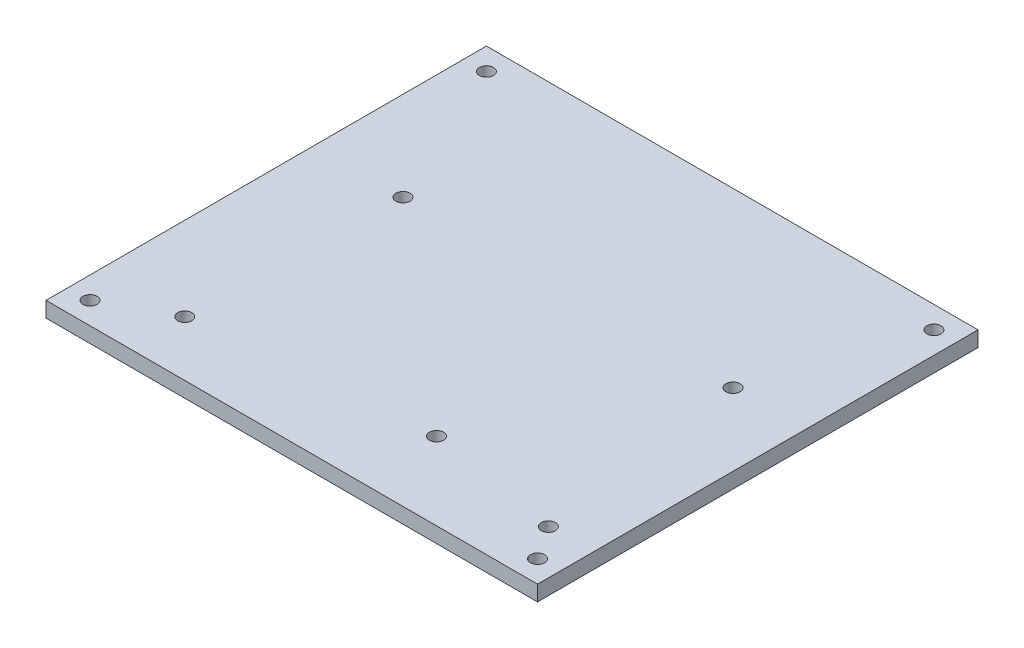
ISO-10303-21;
HEADER;
FILE_DESCRIPTION(('STEP AP214'),'2;1');
FILE_NAME('part.step','',(''),(''),'','','');
FILE_SCHEMA(('AUTOMOTIVE_DESIGN { 1 0 10303 214 1 1 1 1 }'));
ENDSEC;
DATA;
#1=APPLICATION_CONTEXT('core data for automotive mechanical design processes');
#2=APPLICATION_PROTOCOL_DEFINITION('international standard','automotive_design',2000,#1);
#3=PRODUCT_CONTEXT('',#1,'mechanical');
#4=PRODUCT('Part','Part','',(#3));
#5=PRODUCT_RELATED_PRODUCT_CATEGORY('part','',(#4));
#6=PRODUCT_DEFINITION_FORMATION('','',#4);
#7=PRODUCT_DEFINITION_CONTEXT('part definition',#1,'design');
#8=PRODUCT_DEFINITION('design','',#6,#7);
#9=PRODUCT_DEFINITION_SHAPE('','',#8);
#10=(LENGTH_UNIT() NAMED_UNIT(*) SI_UNIT(.MILLI.,.METRE.));
#11=(NAMED_UNIT(*) PLANE_ANGLE_UNIT() SI_UNIT($,.RADIAN.));
#12=(NAMED_UNIT(*) SI_UNIT($,.STERADIAN.) SOLID_ANGLE_UNIT());
#13=UNCERTAINTY_MEASURE_WITH_UNIT(LENGTH_MEASURE(1.E-05),#10,'distance_accuracy_value','');
#14=(GEOMETRIC_REPRESENTATION_CONTEXT(3) GLOBAL_UNCERTAINTY_ASSIGNED_CONTEXT((#13)) GLOBAL_UNIT_ASSIGNED_CONTEXT((#10,
#11,#12)) REPRESENTATION_CONTEXT('',''));
#15=CARTESIAN_POINT('',(0.,0.,0.));
#16=DIRECTION('',(0.,0.,1.));
#17=DIRECTION('',(1.,0.,0.));
#18=AXIS2_PLACEMENT_3D('',#15,#16,#17);
#19=CARTESIAN_POINT('',(0.,3.5,0.));
#20=DIRECTION('',(0.,-1.,0.));
#21=DIRECTION('',(0.,0.,-1.));
#22=AXIS2_PLACEMENT_3D('',#19,#20,#21);
#23=PLANE('',#22);
#24=DIRECTION('',(0.,0.,1.));
#25=VECTOR('',#24,1.);
#26=CARTESIAN_POINT('',(0.,3.5,0.));
#27=LINE('',#26,#25);
#28=CARTESIAN_POINT('',(0.,3.5,-100.));
#29=VERTEX_POINT('',#28);
#30=CARTESIAN_POINT('',(0.,3.5,0.));
#31=VERTEX_POINT('',#30);
#32=EDGE_CURVE('E92',#29,#31,#27,.T.);
#33=ORIENTED_EDGE('',*,*,#32,.T.);
#34=DIRECTION('',(1.,0.,0.));
#35=VECTOR('',#34,1.);
#36=CARTESIAN_POINT('',(0.,3.5,0.));
#37=LINE('',#36,#35);
#38=CARTESIAN_POINT('',(111.6,3.5,0.));
#39=VERTEX_POINT('',#38);
#40=EDGE_CURVE('E87',#31,#39,#37,.T.);
#41=ORIENTED_EDGE('',*,*,#40,.T.);
#42=DIRECTION('',(0.,0.,-1.));
#43=VECTOR('',#42,1.);
#44=CARTESIAN_POINT('',(111.6,3.5,0.));
#45=LINE('',#44,#43);
#46=CARTESIAN_POINT('',(111.6,3.5,-100.));
#47=VERTEX_POINT('',#46);
#48=EDGE_CURVE('E90',#39,#47,#45,.T.);
#49=ORIENTED_EDGE('',*,*,#48,.T.);
#50=DIRECTION('',(-1.,0.,0.));
#51=VECTOR('',#50,1.);
#52=CARTESIAN_POINT('',(0.,3.5,-100.));
#53=LINE('',#52,#51);
#54=EDGE_CURVE('E57',#47,#29,#53,.T.);
#55=ORIENTED_EDGE('',*,*,#54,.T.);
#56=EDGE_LOOP('',(#33,#41,#49,#55));
#57=FACE_BOUND('',#56,.T.);
#58=CARTESIAN_POINT('',(20.24,3.5,-60.8));
#59=DIRECTION('',(0.,1.,0.));
#60=DIRECTION('',(0.,0.,1.));
#61=AXIS2_PLACEMENT_3D('',#58,#59,#60);
#62=CIRCLE('',#61,1.60000000000001);
#63=CARTESIAN_POINT('',(20.24,3.5,-59.2));
#64=VERTEX_POINT('',#63);
#65=EDGE_CURVE('E112',#64,#64,#62,.T.);
#66=ORIENTED_EDGE('',*,*,#65,.F.);
#67=EDGE_LOOP('',(#66));
#68=FACE_BOUND('',#67,.T.);
#69=CARTESIAN_POINT('',(18.97,3.5,-12.54));
#70=DIRECTION('',(0.,1.,0.));
#71=DIRECTION('',(0.,0.,1.));
#72=AXIS2_PLACEMENT_3D('',#69,#70,#71);
#73=CIRCLE('',#72,1.6);
#74=CARTESIAN_POINT('',(18.97,3.5,-10.94));
#75=VERTEX_POINT('',#74);
#76=EDGE_CURVE('E134',#75,#75,#73,.T.);
#77=ORIENTED_EDGE('',*,*,#76,.F.);
#78=EDGE_LOOP('',(#77));
#79=FACE_BOUND('',#78,.T.);
#80=CARTESIAN_POINT('',(71.04,3.5,-17.62));
#81=DIRECTION('',(0.,1.,0.));
#82=DIRECTION('',(0.,0.,1.));
#83=AXIS2_PLACEMENT_3D('',#80,#81,#82);
#84=CIRCLE('',#83,1.6);
#85=CARTESIAN_POINT('',(71.04,3.5,-16.02));
#86=VERTEX_POINT('',#85);
#87=EDGE_CURVE('E142',#86,#86,#84,.T.);
#88=ORIENTED_EDGE('',*,*,#87,.F.);
#89=EDGE_LOOP('',(#88));
#90=FACE_BOUND('',#89,.T.);
#91=CARTESIAN_POINT('',(101.52,3.5,-12.54));
#92=DIRECTION('',(0.,1.,0.));
#93=DIRECTION('',(0.,0.,1.));
#94=AXIS2_PLACEMENT_3D('',#91,#92,#93);
#95=CIRCLE('',#94,1.6);
#96=CARTESIAN_POINT('',(101.52,3.5,-10.94));
#97=VERTEX_POINT('',#96);
#98=EDGE_CURVE('E150',#97,#97,#95,.T.);
#99=ORIENTED_EDGE('',*,*,#98,.F.);
#100=EDGE_LOOP('',(#99));
#101=FACE_BOUND('',#100,.T.);
#102=CARTESIAN_POINT('',(95.17,3.5,-60.8));
#103=DIRECTION('',(0.,1.,0.));
#104=DIRECTION('',(0.,0.,1.));
#105=AXIS2_PLACEMENT_3D('',#102,#103,#104);
#106=CIRCLE('',#105,1.60000000000001);
#107=CARTESIAN_POINT('',(95.17,3.5,-59.2));
#108=VERTEX_POINT('',#107);
#109=EDGE_CURVE('E158',#108,#108,#106,.T.);
#110=ORIENTED_EDGE('',*,*,#109,.F.);
#111=EDGE_LOOP('',(#110));
#112=FACE_BOUND('',#111,.T.);
#113=CARTESIAN_POINT('',(106.6,3.5,-4.99999999999999));
#114=DIRECTION('',(0.,1.,0.));
#115=DIRECTION('',(0.,0.,1.));
#116=AXIS2_PLACEMENT_3D('',#113,#114,#115);
#117=CIRCLE('',#116,1.59999999999999);
#118=CARTESIAN_POINT('',(106.6,3.5,-3.4));
#119=VERTEX_POINT('',#118);
#120=EDGE_CURVE('E166',#119,#119,#117,.T.);
#121=ORIENTED_EDGE('',*,*,#120,.F.);
#122=EDGE_LOOP('',(#121));
#123=FACE_BOUND('',#122,.T.);
#124=CARTESIAN_POINT('',(5.,3.5,-4.99999999999999));
#125=DIRECTION('',(0.,1.,0.));
#126=DIRECTION('',(0.,0.,-1.));
#127=AXIS2_PLACEMENT_3D('',#124,#125,#126);
#128=CIRCLE('',#127,1.59999999999999);
#129=CARTESIAN_POINT('',(5.,3.5,-6.59999999999998));
#130=VERTEX_POINT('',#129);
#131=EDGE_CURVE('E174',#130,#130,#128,.T.);
#132=ORIENTED_EDGE('',*,*,#131,.F.);
#133=EDGE_LOOP('',(#132));
#134=FACE_BOUND('',#133,.T.);
#135=CARTESIAN_POINT('',(106.6,3.5,-95.));
#136=DIRECTION('',(0.,1.,0.));
#137=DIRECTION('',(0.,0.,1.));
#138=AXIS2_PLACEMENT_3D('',#135,#136,#137);
#139=CIRCLE('',#138,1.60000000000001);
#140=CARTESIAN_POINT('',(106.6,3.5,-93.4));
#141=VERTEX_POINT('',#140);
#142=EDGE_CURVE('E182',#141,#141,#139,.T.);
#143=ORIENTED_EDGE('',*,*,#142,.F.);
#144=EDGE_LOOP('',(#143));
#145=FACE_BOUND('',#144,.T.);
#146=CARTESIAN_POINT('',(5.,3.5,-95.));
#147=DIRECTION('',(0.,1.,0.));
#148=DIRECTION('',(0.,0.,-1.));
#149=AXIS2_PLACEMENT_3D('',#146,#147,#148);
#150=CIRCLE('',#149,1.60000000000001);
#151=CARTESIAN_POINT('',(5.,3.5,-96.6));
#152=VERTEX_POINT('',#151);
#153=EDGE_CURVE('E190',#152,#152,#150,.T.);
#154=ORIENTED_EDGE('',*,*,#153,.F.);
#155=EDGE_LOOP('',(#154));
#156=FACE_BOUND('',#155,.T.);
#157=ADVANCED_FACE('F39',(#57,#68,#79,#90,#101,#112,#123,#134,#145,#156),#23,.F.);
#158=CARTESIAN_POINT('',(0.,0.,0.));
#159=DIRECTION('',(0.,-1.,0.));
#160=DIRECTION('',(0.,0.,-1.));
#161=AXIS2_PLACEMENT_3D('',#158,#159,#160);
#162=PLANE('',#161);
#163=CARTESIAN_POINT('',(106.6,0.,-95.));
#164=DIRECTION('',(0.,1.,0.));
#165=DIRECTION('',(0.,0.,1.));
#166=AXIS2_PLACEMENT_3D('',#163,#164,#165);
#167=CIRCLE('',#166,1.60000000000001);
#168=CARTESIAN_POINT('',(106.6,0.,-93.4));
#169=VERTEX_POINT('',#168);
#170=EDGE_CURVE('E186',#169,#169,#167,.T.);
#171=ORIENTED_EDGE('',*,*,#170,.T.);
#172=EDGE_LOOP('',(#171));
#173=FACE_BOUND('',#172,.T.);
#174=CARTESIAN_POINT('',(106.6,0.,-4.99999999999999));
#175=DIRECTION('',(0.,1.,0.));
#176=DIRECTION('',(0.,0.,1.));
#177=AXIS2_PLACEMENT_3D('',#174,#175,#176);
#178=CIRCLE('',#177,1.59999999999999);
#179=CARTESIAN_POINT('',(106.6,0.,-3.4));
#180=VERTEX_POINT('',#179);
#181=EDGE_CURVE('E170',#180,#180,#178,.T.);
#182=ORIENTED_EDGE('',*,*,#181,.T.);
#183=EDGE_LOOP('',(#182));
#184=FACE_BOUND('',#183,.T.);
#185=CARTESIAN_POINT('',(101.52,0.,-12.54));
#186=DIRECTION('',(0.,1.,0.));
#187=DIRECTION('',(0.,0.,1.));
#188=AXIS2_PLACEMENT_3D('',#185,#186,#187);
#189=CIRCLE('',#188,1.6);
#190=CARTESIAN_POINT('',(101.52,0.,-10.94));
#191=VERTEX_POINT('',#190);
#192=EDGE_CURVE('E154',#191,#191,#189,.T.);
#193=ORIENTED_EDGE('',*,*,#192,.T.);
#194=EDGE_LOOP('',(#193));
#195=FACE_BOUND('',#194,.T.);
#196=CARTESIAN_POINT('',(18.97,0.,-12.54));
#197=DIRECTION('',(0.,1.,0.));
#198=DIRECTION('',(0.,0.,1.));
#199=AXIS2_PLACEMENT_3D('',#196,#197,#198);
#200=CIRCLE('',#199,1.6);
#201=CARTESIAN_POINT('',(18.97,0.,-10.94));
#202=VERTEX_POINT('',#201);
#203=EDGE_CURVE('E138',#202,#202,#200,.T.);
#204=ORIENTED_EDGE('',*,*,#203,.T.);
#205=EDGE_LOOP('',(#204));
#206=FACE_BOUND('',#205,.T.);
#207=DIRECTION('',(0.,0.,1.));
#208=VECTOR('',#207,1.);
#209=CARTESIAN_POINT('',(0.,0.,0.));
#210=LINE('',#209,#208);
#211=CARTESIAN_POINT('',(0.,0.,-100.));
#212=VERTEX_POINT('',#211);
#213=CARTESIAN_POINT('',(0.,0.,0.));
#214=VERTEX_POINT('',#213);
#215=EDGE_CURVE('E108',#212,#214,#210,.T.);
#216=ORIENTED_EDGE('',*,*,#215,.F.);
#217=DIRECTION('',(-1.,0.,0.));
#218=VECTOR('',#217,1.);
#219=CARTESIAN_POINT('',(0.,0.,-100.));
#220=LINE('',#219,#218);
#221=CARTESIAN_POINT('',(111.6,0.,-100.));
#222=VERTEX_POINT('',#221);
#223=EDGE_CURVE('E80',#222,#212,#220,.T.);
#224=ORIENTED_EDGE('',*,*,#223,.F.);
#225=DIRECTION('',(0.,0.,-1.));
#226=VECTOR('',#225,1.);
#227=CARTESIAN_POINT('',(111.6,0.,0.));
#228=LINE('',#227,#226);
#229=CARTESIAN_POINT('',(111.6,0.,0.));
#230=VERTEX_POINT('',#229);
#231=EDGE_CURVE('E74',#230,#222,#228,.T.);
#232=ORIENTED_EDGE('',*,*,#231,.F.);
#233=DIRECTION('',(1.,0.,0.));
#234=VECTOR('',#233,1.);
#235=CARTESIAN_POINT('',(0.,0.,0.));
#236=LINE('',#235,#234);
#237=EDGE_CURVE('E97',#214,#230,#236,.T.);
#238=ORIENTED_EDGE('',*,*,#237,.F.);
#239=EDGE_LOOP('',(#216,#224,#232,#238));
#240=FACE_BOUND('',#239,.T.);
#241=CARTESIAN_POINT('',(20.24,0.,-60.8));
#242=DIRECTION('',(0.,1.,0.));
#243=DIRECTION('',(0.,0.,1.));
#244=AXIS2_PLACEMENT_3D('',#241,#242,#243);
#245=CIRCLE('',#244,1.60000000000001);
#246=CARTESIAN_POINT('',(20.24,0.,-59.2));
#247=VERTEX_POINT('',#246);
#248=EDGE_CURVE('E130',#247,#247,#245,.T.);
#249=ORIENTED_EDGE('',*,*,#248,.T.);
#250=EDGE_LOOP('',(#249));
#251=FACE_BOUND('',#250,.T.);
#252=CARTESIAN_POINT('',(71.04,0.,-17.62));
#253=DIRECTION('',(0.,1.,0.));
#254=DIRECTION('',(0.,0.,1.));
#255=AXIS2_PLACEMENT_3D('',#252,#253,#254);
#256=CIRCLE('',#255,1.6);
#257=CARTESIAN_POINT('',(71.04,0.,-16.02));
#258=VERTEX_POINT('',#257);
#259=EDGE_CURVE('E146',#258,#258,#256,.T.);
#260=ORIENTED_EDGE('',*,*,#259,.T.);
#261=EDGE_LOOP('',(#260));
#262=FACE_BOUND('',#261,.T.);
#263=CARTESIAN_POINT('',(95.17,0.,-60.8));
#264=DIRECTION('',(0.,1.,0.));
#265=DIRECTION('',(0.,0.,1.));
#266=AXIS2_PLACEMENT_3D('',#263,#264,#265);
#267=CIRCLE('',#266,1.60000000000001);
#268=CARTESIAN_POINT('',(95.17,0.,-59.2));
#269=VERTEX_POINT('',#268);
#270=EDGE_CURVE('E162',#269,#269,#267,.T.);
#271=ORIENTED_EDGE('',*,*,#270,.T.);
#272=EDGE_LOOP('',(#271));
#273=FACE_BOUND('',#272,.T.);
#274=CARTESIAN_POINT('',(5.,0.,-4.99999999999999));
#275=DIRECTION('',(0.,1.,0.));
#276=DIRECTION('',(0.,0.,-1.));
#277=AXIS2_PLACEMENT_3D('',#274,#275,#276);
#278=CIRCLE('',#277,1.59999999999999);
#279=CARTESIAN_POINT('',(5.,0.,-6.59999999999998));
#280=VERTEX_POINT('',#279);
#281=EDGE_CURVE('E178',#280,#280,#278,.T.);
#282=ORIENTED_EDGE('',*,*,#281,.T.);
#283=EDGE_LOOP('',(#282));
#284=FACE_BOUND('',#283,.T.);
#285=CARTESIAN_POINT('',(5.,0.,-95.));
#286=DIRECTION('',(0.,1.,0.));
#287=DIRECTION('',(0.,0.,-1.));
#288=AXIS2_PLACEMENT_3D('',#285,#286,#287);
#289=CIRCLE('',#288,1.60000000000001);
#290=CARTESIAN_POINT('',(5.,0.,-96.6));
#291=VERTEX_POINT('',#290);
#292=EDGE_CURVE('E194',#291,#291,#289,.T.);
#293=ORIENTED_EDGE('',*,*,#292,.T.);
#294=EDGE_LOOP('',(#293));
#295=FACE_BOUND('',#294,.T.);
#296=ADVANCED_FACE('F125',(#173,#184,#195,#206,#240,#251,#262,#273,#284,#295),#162,.T.);
#297=CARTESIAN_POINT('',(0.,3.5,0.));
#298=DIRECTION('',(1.,0.,0.));
#299=DIRECTION('',(0.,0.,-1.));
#300=AXIS2_PLACEMENT_3D('',#297,#298,#299);
#301=PLANE('',#300);
#302=ORIENTED_EDGE('',*,*,#215,.T.);
#303=DIRECTION('',(0.,-1.,0.));
#304=VECTOR('',#303,1.);
#305=CARTESIAN_POINT('',(0.,3.5,0.));
#306=LINE('',#305,#304);
#307=EDGE_CURVE('E11',#31,#214,#306,.T.);
#308=ORIENTED_EDGE('',*,*,#307,.F.);
#309=ORIENTED_EDGE('',*,*,#32,.F.);
#310=DIRECTION('',(0.,-1.,0.));
#311=VECTOR('',#310,1.);
#312=CARTESIAN_POINT('',(0.,3.5,-100.));
#313=LINE('',#312,#311);
#314=EDGE_CURVE('E104',#29,#212,#313,.T.);
#315=ORIENTED_EDGE('',*,*,#314,.T.);
#316=EDGE_LOOP('',(#302,#308,#309,#315));
#317=FACE_BOUND('',#316,.T.);
#318=ADVANCED_FACE('F41',(#317),#301,.F.);
#319=CARTESIAN_POINT('',(0.,3.5,0.));
#320=DIRECTION('',(0.,0.,-1.));
#321=DIRECTION('',(-1.,0.,0.));
#322=AXIS2_PLACEMENT_3D('',#319,#320,#321);
#323=PLANE('',#322);
#324=ORIENTED_EDGE('',*,*,#237,.T.);
#325=DIRECTION('',(0.,-1.,0.));
#326=VECTOR('',#325,1.);
#327=CARTESIAN_POINT('',(111.6,3.5,0.));
#328=LINE('',#327,#326);
#329=EDGE_CURVE('E49',#39,#230,#328,.T.);
#330=ORIENTED_EDGE('',*,*,#329,.F.);
#331=ORIENTED_EDGE('',*,*,#40,.F.);
#332=ORIENTED_EDGE('',*,*,#307,.T.);
#333=EDGE_LOOP('',(#324,#330,#331,#332));
#334=FACE_BOUND('',#333,.T.);
#335=ADVANCED_FACE('F96',(#334),#323,.F.);
#336=CARTESIAN_POINT('',(111.6,3.5,0.));
#337=DIRECTION('',(-1.,0.,0.));
#338=DIRECTION('',(0.,0.,1.));
#339=AXIS2_PLACEMENT_3D('',#336,#337,#338);
#340=PLANE('',#339);
#341=ORIENTED_EDGE('',*,*,#231,.T.);
#342=DIRECTION('',(0.,-1.,0.));
#343=VECTOR('',#342,1.);
#344=CARTESIAN_POINT('',(111.6,3.5,-100.));
#345=LINE('',#344,#343);
#346=EDGE_CURVE('E99',#47,#222,#345,.T.);
#347=ORIENTED_EDGE('',*,*,#346,.F.);
#348=ORIENTED_EDGE('',*,*,#48,.F.);
#349=ORIENTED_EDGE('',*,*,#329,.T.);
#350=EDGE_LOOP('',(#341,#347,#348,#349));
#351=FACE_BOUND('',#350,.T.);
#352=ADVANCED_FACE('F100',(#351),#340,.F.);
#353=CARTESIAN_POINT('',(0.,3.5,-100.));
#354=DIRECTION('',(0.,0.,1.));
#355=DIRECTION('',(1.,0.,0.));
#356=AXIS2_PLACEMENT_3D('',#353,#354,#355);
#357=PLANE('',#356);
#358=ORIENTED_EDGE('',*,*,#223,.T.);
#359=ORIENTED_EDGE('',*,*,#314,.F.);
#360=ORIENTED_EDGE('',*,*,#54,.F.);
#361=ORIENTED_EDGE('',*,*,#346,.T.);
#362=EDGE_LOOP('',(#358,#359,#360,#361));
#363=FACE_BOUND('',#362,.T.);
#364=ADVANCED_FACE('F122',(#363),#357,.F.);
#365=CARTESIAN_POINT('',(20.24,3.5,-60.8));
#366=DIRECTION('',(0.,-1.,0.));
#367=DIRECTION('',(0.,0.,-1.));
#368=AXIS2_PLACEMENT_3D('',#365,#366,#367);
#369=CYLINDRICAL_SURFACE('',#368,1.60000000000001);
#370=ORIENTED_EDGE('',*,*,#65,.T.);
#371=EDGE_LOOP('',(#370));
#372=FACE_BOUND('',#371,.T.);
#373=ORIENTED_EDGE('',*,*,#248,.F.);
#374=EDGE_LOOP('',(#373));
#375=FACE_BOUND('',#374,.T.);
#376=ADVANCED_FACE('F213',(#372,#375),#369,.F.);
#377=CARTESIAN_POINT('',(18.97,3.5,-12.54));
#378=DIRECTION('',(0.,-1.,0.));
#379=DIRECTION('',(0.,0.,-1.));
#380=AXIS2_PLACEMENT_3D('',#377,#378,#379);
#381=CYLINDRICAL_SURFACE('',#380,1.6);
#382=ORIENTED_EDGE('',*,*,#76,.T.);
#383=EDGE_LOOP('',(#382));
#384=FACE_BOUND('',#383,.T.);
#385=ORIENTED_EDGE('',*,*,#203,.F.);
#386=EDGE_LOOP('',(#385));
#387=FACE_BOUND('',#386,.T.);
#388=ADVANCED_FACE('F259',(#384,#387),#381,.F.);
#389=CARTESIAN_POINT('',(71.04,3.5,-17.62));
#390=DIRECTION('',(0.,-1.,0.));
#391=DIRECTION('',(0.,0.,-1.));
#392=AXIS2_PLACEMENT_3D('',#389,#390,#391);
#393=CYLINDRICAL_SURFACE('',#392,1.6);
#394=ORIENTED_EDGE('',*,*,#87,.T.);
#395=EDGE_LOOP('',(#394));
#396=FACE_BOUND('',#395,.T.);
#397=ORIENTED_EDGE('',*,*,#259,.F.);
#398=EDGE_LOOP('',(#397));
#399=FACE_BOUND('',#398,.T.);
#400=ADVANCED_FACE('F267',(#396,#399),#393,.F.);
#401=CARTESIAN_POINT('',(101.52,3.5,-12.54));
#402=DIRECTION('',(0.,-1.,0.));
#403=DIRECTION('',(0.,0.,-1.));
#404=AXIS2_PLACEMENT_3D('',#401,#402,#403);
#405=CYLINDRICAL_SURFACE('',#404,1.6);
#406=ORIENTED_EDGE('',*,*,#98,.T.);
#407=EDGE_LOOP('',(#406));
#408=FACE_BOUND('',#407,.T.);
#409=ORIENTED_EDGE('',*,*,#192,.F.);
#410=EDGE_LOOP('',(#409));
#411=FACE_BOUND('',#410,.T.);
#412=ADVANCED_FACE('F275',(#408,#411),#405,.F.);
#413=CARTESIAN_POINT('',(95.17,3.5,-60.8));
#414=DIRECTION('',(0.,-1.,0.));
#415=DIRECTION('',(0.,0.,-1.));
#416=AXIS2_PLACEMENT_3D('',#413,#414,#415);
#417=CYLINDRICAL_SURFACE('',#416,1.60000000000001);
#418=ORIENTED_EDGE('',*,*,#109,.T.);
#419=EDGE_LOOP('',(#418));
#420=FACE_BOUND('',#419,.T.);
#421=ORIENTED_EDGE('',*,*,#270,.F.);
#422=EDGE_LOOP('',(#421));
#423=FACE_BOUND('',#422,.T.);
#424=ADVANCED_FACE('F284',(#420,#423),#417,.F.);
#425=CARTESIAN_POINT('',(106.6,3.5,-4.99999999999999));
#426=DIRECTION('',(0.,-1.,0.));
#427=DIRECTION('',(0.,0.,-1.));
#428=AXIS2_PLACEMENT_3D('',#425,#426,#427);
#429=CYLINDRICAL_SURFACE('',#428,1.59999999999999);
#430=ORIENTED_EDGE('',*,*,#120,.T.);
#431=EDGE_LOOP('',(#430));
#432=FACE_BOUND('',#431,.T.);
#433=ORIENTED_EDGE('',*,*,#181,.F.);
#434=EDGE_LOOP('',(#433));
#435=FACE_BOUND('',#434,.T.);
#436=ADVANCED_FACE('F293',(#432,#435),#429,.F.);
#437=CARTESIAN_POINT('',(5.,3.5,-4.99999999999999));
#438=DIRECTION('',(0.,-1.,0.));
#439=DIRECTION('',(0.,0.,-1.));
#440=AXIS2_PLACEMENT_3D('',#437,#438,#439);
#441=CYLINDRICAL_SURFACE('',#440,1.59999999999999);
#442=ORIENTED_EDGE('',*,*,#131,.T.);
#443=EDGE_LOOP('',(#442));
#444=FACE_BOUND('',#443,.T.);
#445=ORIENTED_EDGE('',*,*,#281,.F.);
#446=EDGE_LOOP('',(#445));
#447=FACE_BOUND('',#446,.T.);
#448=ADVANCED_FACE('F302',(#444,#447),#441,.F.);
#449=CARTESIAN_POINT('',(106.6,3.5,-95.));
#450=DIRECTION('',(0.,-1.,0.));
#451=DIRECTION('',(0.,0.,-1.));
#452=AXIS2_PLACEMENT_3D('',#449,#450,#451);
#453=CYLINDRICAL_SURFACE('',#452,1.60000000000001);
#454=ORIENTED_EDGE('',*,*,#142,.T.);
#455=EDGE_LOOP('',(#454));
#456=FACE_BOUND('',#455,.T.);
#457=ORIENTED_EDGE('',*,*,#170,.F.);
#458=EDGE_LOOP('',(#457));
#459=FACE_BOUND('',#458,.T.);
#460=ADVANCED_FACE('F311',(#456,#459),#453,.F.);
#461=CARTESIAN_POINT('',(5.,3.5,-95.));
#462=DIRECTION('',(0.,-1.,0.));
#463=DIRECTION('',(0.,0.,-1.));
#464=AXIS2_PLACEMENT_3D('',#461,#462,#463);
#465=CYLINDRICAL_SURFACE('',#464,1.60000000000001);
#466=ORIENTED_EDGE('',*,*,#153,.T.);
#467=EDGE_LOOP('',(#466));
#468=FACE_BOUND('',#467,.T.);
#469=ORIENTED_EDGE('',*,*,#292,.F.);
#470=EDGE_LOOP('',(#469));
#471=FACE_BOUND('',#470,.T.);
#472=ADVANCED_FACE('F202',(#468,#471),#465,.F.);
#473=CLOSED_SHELL('',(#157,#296,#318,#335,#352,#364,#376,#388,#400,#412,#424,#436,#448,#460,#472));
#474=MANIFOLD_SOLID_BREP('B2',#473);
#475=ADVANCED_BREP_SHAPE_REPRESENTATION('',(#18,#474),#14);
#476=SHAPE_DEFINITION_REPRESENTATION(#9,#475);
ENDSEC;
END-ISO-10303-21;
